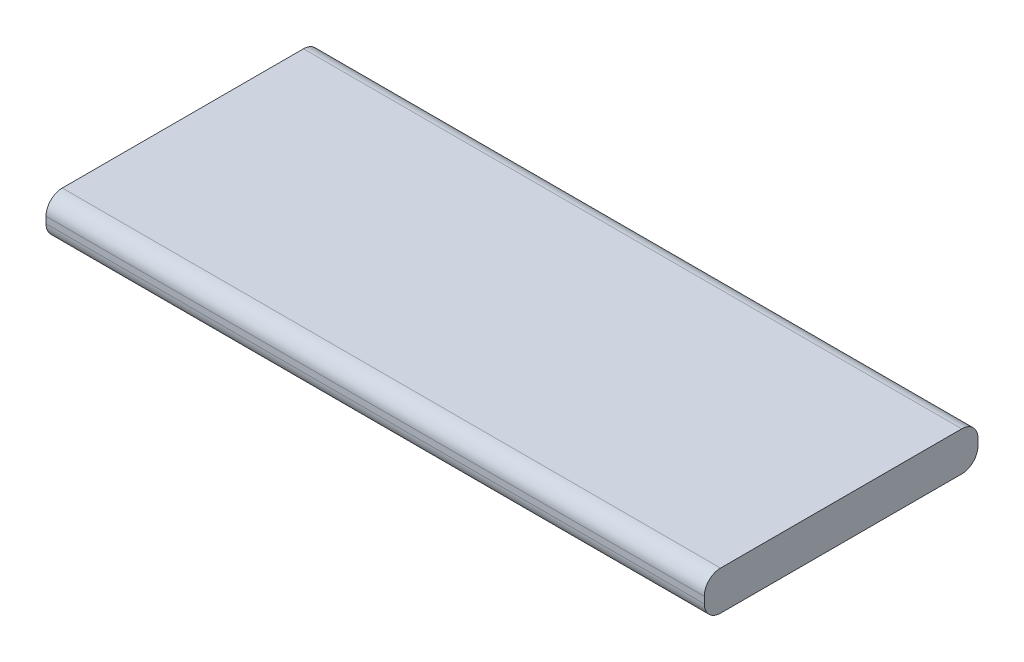
ISO-10303-21;
HEADER;
FILE_DESCRIPTION(('STEP AP214'),'2;1');
FILE_NAME('part.step','',(''),(''),'','','');
FILE_SCHEMA(('AUTOMOTIVE_DESIGN { 1 0 10303 214 1 1 1 1 }'));
ENDSEC;
DATA;
#1=APPLICATION_CONTEXT('core data for automotive mechanical design processes');
#2=APPLICATION_PROTOCOL_DEFINITION('international standard','automotive_design',2000,#1);
#3=PRODUCT_CONTEXT('',#1,'mechanical');
#4=PRODUCT('Part','Part','',(#3));
#5=PRODUCT_RELATED_PRODUCT_CATEGORY('part','',(#4));
#6=PRODUCT_DEFINITION_FORMATION('','',#4);
#7=PRODUCT_DEFINITION_CONTEXT('part definition',#1,'design');
#8=PRODUCT_DEFINITION('design','',#6,#7);
#9=PRODUCT_DEFINITION_SHAPE('','',#8);
#10=(LENGTH_UNIT() NAMED_UNIT(*) SI_UNIT(.MILLI.,.METRE.));
#11=(NAMED_UNIT(*) PLANE_ANGLE_UNIT() SI_UNIT($,.RADIAN.));
#12=(NAMED_UNIT(*) SI_UNIT($,.STERADIAN.) SOLID_ANGLE_UNIT());
#13=UNCERTAINTY_MEASURE_WITH_UNIT(LENGTH_MEASURE(1.E-05),#10,'distance_accuracy_value','');
#14=(GEOMETRIC_REPRESENTATION_CONTEXT(3) GLOBAL_UNCERTAINTY_ASSIGNED_CONTEXT((#13)) GLOBAL_UNIT_ASSIGNED_CONTEXT((#10,
#11,#12)) REPRESENTATION_CONTEXT('',''));
#15=CARTESIAN_POINT('',(0.,0.,0.));
#16=DIRECTION('',(0.,0.,1.));
#17=DIRECTION('',(1.,0.,0.));
#18=AXIS2_PLACEMENT_3D('',#15,#16,#17);
#19=CARTESIAN_POINT('',(-5.05,0.6,2.1));
#20=DIRECTION('',(1.,0.,0.));
#21=DIRECTION('',(0.,0.,-1.));
#22=AXIS2_PLACEMENT_3D('',#19,#20,#21);
#23=PLANE('',#22);
#24=DIRECTION('',(0.,0.,1.));
#25=VECTOR('',#24,1.);
#26=CARTESIAN_POINT('',(-5.05,0.,2.1));
#27=LINE('',#26,#25);
#28=CARTESIAN_POINT('',(-5.05,0.,-1.85));
#29=VERTEX_POINT('',#28);
#30=CARTESIAN_POINT('',(-5.05,0.,1.85));
#31=VERTEX_POINT('',#30);
#32=EDGE_CURVE('E138',#29,#31,#27,.T.);
#33=ORIENTED_EDGE('',*,*,#32,.T.);
#34=CARTESIAN_POINT('',(-5.05,0.25,1.85));
#35=DIRECTION('',(1.,0.,0.));
#36=DIRECTION('',(0.,0.,-1.));
#37=AXIS2_PLACEMENT_3D('',#34,#35,#36);
#38=CIRCLE('',#37,0.25);
#39=CARTESIAN_POINT('',(-5.05,0.25,2.1));
#40=VERTEX_POINT('',#39);
#41=EDGE_CURVE('E49',#31,#40,#38,.F.);
#42=ORIENTED_EDGE('',*,*,#41,.T.);
#43=DIRECTION('',(0.,-1.,0.));
#44=VECTOR('',#43,1.);
#45=CARTESIAN_POINT('',(-5.05,0.6,2.1));
#46=LINE('',#45,#44);
#47=CARTESIAN_POINT('',(-5.05,0.35,2.1));
#48=VERTEX_POINT('',#47);
#49=EDGE_CURVE('E149',#48,#40,#46,.T.);
#50=ORIENTED_EDGE('',*,*,#49,.F.);
#51=CARTESIAN_POINT('',(-5.05,0.35,1.85));
#52=DIRECTION('',(1.,0.,0.));
#53=DIRECTION('',(0.,0.,-1.));
#54=AXIS2_PLACEMENT_3D('',#51,#52,#53);
#55=CIRCLE('',#54,0.25);
#56=CARTESIAN_POINT('',(-5.05,0.6,1.85));
#57=VERTEX_POINT('',#56);
#58=EDGE_CURVE('E118',#48,#57,#55,.F.);
#59=ORIENTED_EDGE('',*,*,#58,.T.);
#60=DIRECTION('',(0.,0.,1.));
#61=VECTOR('',#60,1.);
#62=CARTESIAN_POINT('',(-5.05,0.6,2.1));
#63=LINE('',#62,#61);
#64=CARTESIAN_POINT('',(-5.05,0.6,-1.85));
#65=VERTEX_POINT('',#64);
#66=EDGE_CURVE('E125',#65,#57,#63,.T.);
#67=ORIENTED_EDGE('',*,*,#66,.F.);
#68=CARTESIAN_POINT('',(-5.05,0.35,-1.85));
#69=DIRECTION('',(1.,0.,0.));
#70=DIRECTION('',(0.,0.,-1.));
#71=AXIS2_PLACEMENT_3D('',#68,#69,#70);
#72=CIRCLE('',#71,0.25);
#73=CARTESIAN_POINT('',(-5.05,0.35,-2.1));
#74=VERTEX_POINT('',#73);
#75=EDGE_CURVE('E108',#65,#74,#72,.F.);
#76=ORIENTED_EDGE('',*,*,#75,.T.);
#77=DIRECTION('',(0.,-1.,0.));
#78=VECTOR('',#77,1.);
#79=CARTESIAN_POINT('',(-5.05,0.6,-2.1));
#80=LINE('',#79,#78);
#81=CARTESIAN_POINT('',(-5.05,0.25,-2.1));
#82=VERTEX_POINT('',#81);
#83=EDGE_CURVE('E135',#74,#82,#80,.T.);
#84=ORIENTED_EDGE('',*,*,#83,.T.);
#85=CARTESIAN_POINT('',(-5.05,0.25,-1.85));
#86=DIRECTION('',(1.,0.,0.));
#87=DIRECTION('',(0.,0.,-1.));
#88=AXIS2_PLACEMENT_3D('',#85,#86,#87);
#89=CIRCLE('',#88,0.25);
#90=EDGE_CURVE('E56',#82,#29,#89,.F.);
#91=ORIENTED_EDGE('',*,*,#90,.T.);
#92=EDGE_LOOP('',(#33,#42,#50,#59,#67,#76,#84,#91));
#93=FACE_BOUND('',#92,.T.);
#94=ADVANCED_FACE('F41',(#93),#23,.F.);
#95=CARTESIAN_POINT('',(5.05,0.6,2.1));
#96=DIRECTION('',(0.,0.,-1.));
#97=DIRECTION('',(-1.,0.,0.));
#98=AXIS2_PLACEMENT_3D('',#95,#96,#97);
#99=PLANE('',#98);
#100=ORIENTED_EDGE('',*,*,#49,.T.);
#101=DIRECTION('',(1.,0.,0.));
#102=VECTOR('',#101,1.);
#103=CARTESIAN_POINT('',(5.05,0.25,2.1));
#104=LINE('',#103,#102);
#105=CARTESIAN_POINT('',(5.05,0.25,2.1));
#106=VERTEX_POINT('',#105);
#107=EDGE_CURVE('E161',#40,#106,#104,.T.);
#108=ORIENTED_EDGE('',*,*,#107,.T.);
#109=DIRECTION('',(0.,-1.,0.));
#110=VECTOR('',#109,1.);
#111=CARTESIAN_POINT('',(5.05,0.6,2.1));
#112=LINE('',#111,#110);
#113=CARTESIAN_POINT('',(5.05,0.35,2.1));
#114=VERTEX_POINT('',#113);
#115=EDGE_CURVE('E146',#114,#106,#112,.T.);
#116=ORIENTED_EDGE('',*,*,#115,.F.);
#117=DIRECTION('',(1.,0.,0.));
#118=VECTOR('',#117,1.);
#119=CARTESIAN_POINT('',(-5.05,0.35,2.1));
#120=LINE('',#119,#118);
#121=EDGE_CURVE('E159',#114,#48,#120,.F.);
#122=ORIENTED_EDGE('',*,*,#121,.T.);
#123=EDGE_LOOP('',(#100,#108,#116,#122));
#124=FACE_BOUND('',#123,.T.);
#125=ADVANCED_FACE('F175',(#124),#99,.F.);
#126=CARTESIAN_POINT('',(5.05,0.6,2.1));
#127=DIRECTION('',(-1.,0.,0.));
#128=DIRECTION('',(0.,0.,1.));
#129=AXIS2_PLACEMENT_3D('',#126,#127,#128);
#130=PLANE('',#129);
#131=ORIENTED_EDGE('',*,*,#115,.T.);
#132=CARTESIAN_POINT('',(5.05,0.25,1.85));
#133=DIRECTION('',(-1.,0.,0.));
#134=DIRECTION('',(0.,0.,1.));
#135=AXIS2_PLACEMENT_3D('',#132,#133,#134);
#136=CIRCLE('',#135,0.25);
#137=CARTESIAN_POINT('',(5.05,0.,1.85));
#138=VERTEX_POINT('',#137);
#139=EDGE_CURVE('E166',#106,#138,#136,.F.);
#140=ORIENTED_EDGE('',*,*,#139,.T.);
#141=DIRECTION('',(0.,0.,-1.));
#142=VECTOR('',#141,1.);
#143=CARTESIAN_POINT('',(5.05,0.,2.1));
#144=LINE('',#143,#142);
#145=CARTESIAN_POINT('',(5.05,0.,-1.85));
#146=VERTEX_POINT('',#145);
#147=EDGE_CURVE('E133',#138,#146,#144,.T.);
#148=ORIENTED_EDGE('',*,*,#147,.T.);
#149=CARTESIAN_POINT('',(5.05,0.25,-1.85));
#150=DIRECTION('',(-1.,0.,0.));
#151=DIRECTION('',(0.,0.,1.));
#152=AXIS2_PLACEMENT_3D('',#149,#150,#151);
#153=CIRCLE('',#152,0.25);
#154=CARTESIAN_POINT('',(5.05,0.25,-2.1));
#155=VERTEX_POINT('',#154);
#156=EDGE_CURVE('E164',#146,#155,#153,.F.);
#157=ORIENTED_EDGE('',*,*,#156,.T.);
#158=DIRECTION('',(0.,-1.,0.));
#159=VECTOR('',#158,1.);
#160=CARTESIAN_POINT('',(5.05,0.6,-2.1));
#161=LINE('',#160,#159);
#162=CARTESIAN_POINT('',(5.05,0.35,-2.1));
#163=VERTEX_POINT('',#162);
#164=EDGE_CURVE('E143',#163,#155,#161,.T.);
#165=ORIENTED_EDGE('',*,*,#164,.F.);
#166=CARTESIAN_POINT('',(5.05,0.35,-1.85));
#167=DIRECTION('',(-1.,0.,0.));
#168=DIRECTION('',(0.,0.,1.));
#169=AXIS2_PLACEMENT_3D('',#166,#167,#168);
#170=CIRCLE('',#169,0.25);
#171=CARTESIAN_POINT('',(5.05,0.6,-1.85));
#172=VERTEX_POINT('',#171);
#173=EDGE_CURVE('E157',#163,#172,#170,.F.);
#174=ORIENTED_EDGE('',*,*,#173,.T.);
#175=DIRECTION('',(0.,0.,-1.));
#176=VECTOR('',#175,1.);
#177=CARTESIAN_POINT('',(5.05,0.6,2.1));
#178=LINE('',#177,#176);
#179=CARTESIAN_POINT('',(5.05,0.6,1.85));
#180=VERTEX_POINT('',#179);
#181=EDGE_CURVE('E128',#180,#172,#178,.T.);
#182=ORIENTED_EDGE('',*,*,#181,.F.);
#183=CARTESIAN_POINT('',(5.05,0.35,1.85));
#184=DIRECTION('',(-1.,0.,0.));
#185=DIRECTION('',(0.,0.,1.));
#186=AXIS2_PLACEMENT_3D('',#183,#184,#185);
#187=CIRCLE('',#186,0.25);
#188=EDGE_CURVE('E155',#180,#114,#187,.F.);
#189=ORIENTED_EDGE('',*,*,#188,.T.);
#190=EDGE_LOOP('',(#131,#140,#148,#157,#165,#174,#182,#189));
#191=FACE_BOUND('',#190,.T.);
#192=ADVANCED_FACE('F180',(#191),#130,.F.);
#193=CARTESIAN_POINT('',(5.05,0.6,-2.1));
#194=DIRECTION('',(0.,0.,1.));
#195=DIRECTION('',(1.,0.,0.));
#196=AXIS2_PLACEMENT_3D('',#193,#194,#195);
#197=PLANE('',#196);
#198=ORIENTED_EDGE('',*,*,#164,.T.);
#199=DIRECTION('',(-1.,0.,0.));
#200=VECTOR('',#199,1.);
#201=CARTESIAN_POINT('',(5.05,0.25,-2.1));
#202=LINE('',#201,#200);
#203=EDGE_CURVE('E11',#155,#82,#202,.T.);
#204=ORIENTED_EDGE('',*,*,#203,.T.);
#205=ORIENTED_EDGE('',*,*,#83,.F.);
#206=DIRECTION('',(-1.,0.,0.));
#207=VECTOR('',#206,1.);
#208=CARTESIAN_POINT('',(5.05,0.35,-2.1));
#209=LINE('',#208,#207);
#210=EDGE_CURVE('E113',#74,#163,#209,.F.);
#211=ORIENTED_EDGE('',*,*,#210,.T.);
#212=EDGE_LOOP('',(#198,#204,#205,#211));
#213=FACE_BOUND('',#212,.T.);
#214=ADVANCED_FACE('F185',(#213),#197,.F.);
#215=CARTESIAN_POINT('',(0.,0.6,0.));
#216=DIRECTION('',(0.,1.,0.));
#217=DIRECTION('',(0.,0.,1.));
#218=AXIS2_PLACEMENT_3D('',#215,#216,#217);
#219=PLANE('',#218);
#220=ORIENTED_EDGE('',*,*,#181,.T.);
#221=DIRECTION('',(-1.,0.,0.));
#222=VECTOR('',#221,1.);
#223=CARTESIAN_POINT('',(-5.05,0.6,-1.85));
#224=LINE('',#223,#222);
#225=EDGE_CURVE('E112',#172,#65,#224,.T.);
#226=ORIENTED_EDGE('',*,*,#225,.T.);
#227=ORIENTED_EDGE('',*,*,#66,.T.);
#228=DIRECTION('',(1.,0.,0.));
#229=VECTOR('',#228,1.);
#230=CARTESIAN_POINT('',(5.05,0.6,1.85));
#231=LINE('',#230,#229);
#232=EDGE_CURVE('E129',#57,#180,#231,.T.);
#233=ORIENTED_EDGE('',*,*,#232,.T.);
#234=EDGE_LOOP('',(#220,#226,#227,#233));
#235=FACE_BOUND('',#234,.T.);
#236=ADVANCED_FACE('F123',(#235),#219,.T.);
#237=CARTESIAN_POINT('',(0.,0.,0.));
#238=DIRECTION('',(0.,1.,0.));
#239=DIRECTION('',(0.,0.,1.));
#240=AXIS2_PLACEMENT_3D('',#237,#238,#239);
#241=PLANE('',#240);
#242=ORIENTED_EDGE('',*,*,#147,.F.);
#243=DIRECTION('',(1.,0.,0.));
#244=VECTOR('',#243,1.);
#245=CARTESIAN_POINT('',(0.,0.,1.85));
#246=LINE('',#245,#244);
#247=EDGE_CURVE('E63',#138,#31,#246,.F.);
#248=ORIENTED_EDGE('',*,*,#247,.T.);
#249=ORIENTED_EDGE('',*,*,#32,.F.);
#250=DIRECTION('',(-1.,0.,0.));
#251=VECTOR('',#250,1.);
#252=CARTESIAN_POINT('',(0.,0.,-1.85));
#253=LINE('',#252,#251);
#254=EDGE_CURVE('E168',#29,#146,#253,.F.);
#255=ORIENTED_EDGE('',*,*,#254,.T.);
#256=EDGE_LOOP('',(#242,#248,#249,#255));
#257=FACE_BOUND('',#256,.T.);
#258=ADVANCED_FACE('F182',(#257),#241,.F.);
#259=CARTESIAN_POINT('',(0.,0.35,-1.85));
#260=DIRECTION('',(1.,0.,0.));
#261=DIRECTION('',(0.,0.,-1.));
#262=AXIS2_PLACEMENT_3D('',#259,#260,#261);
#263=CYLINDRICAL_SURFACE('',#262,0.25);
#264=ORIENTED_EDGE('',*,*,#173,.F.);
#265=ORIENTED_EDGE('',*,*,#210,.F.);
#266=ORIENTED_EDGE('',*,*,#75,.F.);
#267=ORIENTED_EDGE('',*,*,#225,.F.);
#268=EDGE_LOOP('',(#264,#265,#266,#267));
#269=FACE_BOUND('',#268,.T.);
#270=ADVANCED_FACE('F111',(#269),#263,.T.);
#271=CARTESIAN_POINT('',(0.,0.35,1.85));
#272=DIRECTION('',(-1.,0.,0.));
#273=DIRECTION('',(0.,0.,1.));
#274=AXIS2_PLACEMENT_3D('',#271,#272,#273);
#275=CYLINDRICAL_SURFACE('',#274,0.25);
#276=ORIENTED_EDGE('',*,*,#58,.F.);
#277=ORIENTED_EDGE('',*,*,#121,.F.);
#278=ORIENTED_EDGE('',*,*,#188,.F.);
#279=ORIENTED_EDGE('',*,*,#232,.F.);
#280=EDGE_LOOP('',(#276,#277,#278,#279));
#281=FACE_BOUND('',#280,.T.);
#282=ADVANCED_FACE('F204',(#281),#275,.T.);
#283=CARTESIAN_POINT('',(5.05,0.25,1.85));
#284=DIRECTION('',(1.,0.,0.));
#285=DIRECTION('',(0.,0.,-1.));
#286=AXIS2_PLACEMENT_3D('',#283,#284,#285);
#287=CYLINDRICAL_SURFACE('',#286,0.25);
#288=ORIENTED_EDGE('',*,*,#41,.F.);
#289=ORIENTED_EDGE('',*,*,#247,.F.);
#290=ORIENTED_EDGE('',*,*,#139,.F.);
#291=ORIENTED_EDGE('',*,*,#107,.F.);
#292=EDGE_LOOP('',(#288,#289,#290,#291));
#293=FACE_BOUND('',#292,.T.);
#294=ADVANCED_FACE('F178',(#293),#287,.T.);
#295=CARTESIAN_POINT('',(5.05,0.25,-1.85));
#296=DIRECTION('',(-1.,0.,0.));
#297=DIRECTION('',(0.,0.,1.));
#298=AXIS2_PLACEMENT_3D('',#295,#296,#297);
#299=CYLINDRICAL_SURFACE('',#298,0.25);
#300=ORIENTED_EDGE('',*,*,#156,.F.);
#301=ORIENTED_EDGE('',*,*,#254,.F.);
#302=ORIENTED_EDGE('',*,*,#90,.F.);
#303=ORIENTED_EDGE('',*,*,#203,.F.);
#304=EDGE_LOOP('',(#300,#301,#302,#303));
#305=FACE_BOUND('',#304,.T.);
#306=ADVANCED_FACE('F43',(#305),#299,.T.);
#307=CLOSED_SHELL('',(#94,#125,#192,#214,#236,#258,#270,#282,#294,#306));
#308=MANIFOLD_SOLID_BREP('B2',#307);
#309=ADVANCED_BREP_SHAPE_REPRESENTATION('',(#18,#308),#14);
#310=SHAPE_DEFINITION_REPRESENTATION(#9,#309);
ENDSEC;
END-ISO-10303-21;
